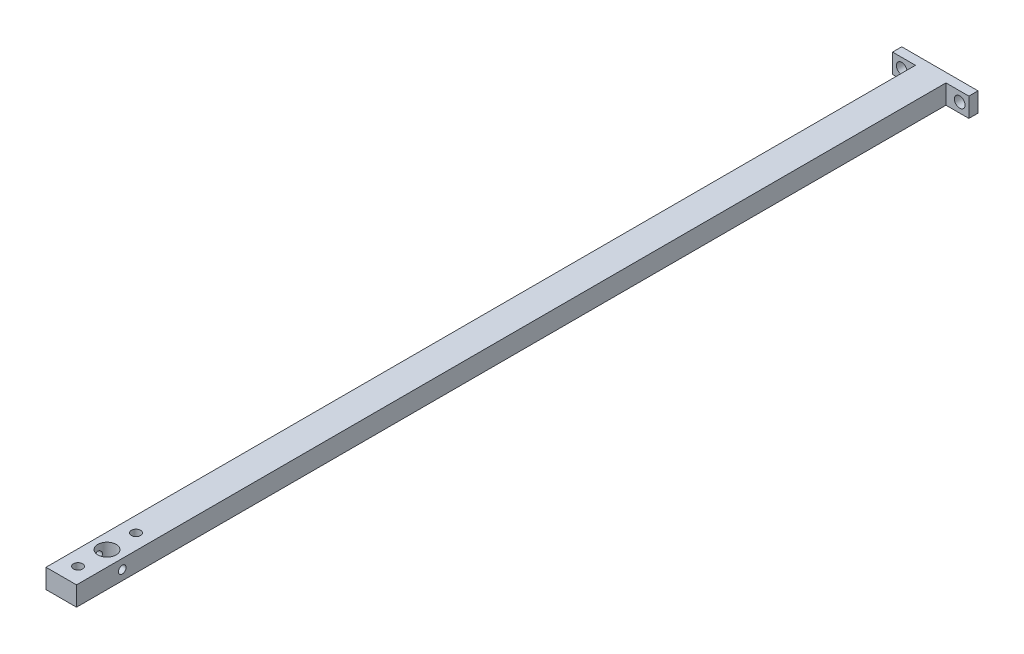
ISO-10303-21;
HEADER;
FILE_DESCRIPTION(('STEP AP214'),'2;1');
FILE_NAME('part.step','',(''),(''),'','','');
FILE_SCHEMA(('AUTOMOTIVE_DESIGN { 1 0 10303 214 1 1 1 1 }'));
ENDSEC;
DATA;
#1=APPLICATION_CONTEXT('core data for automotive mechanical design processes');
#2=APPLICATION_PROTOCOL_DEFINITION('international standard','automotive_design',2000,#1);
#3=PRODUCT_CONTEXT('',#1,'mechanical');
#4=PRODUCT('Part','Part','',(#3));
#5=PRODUCT_RELATED_PRODUCT_CATEGORY('part','',(#4));
#6=PRODUCT_DEFINITION_FORMATION('','',#4);
#7=PRODUCT_DEFINITION_CONTEXT('part definition',#1,'design');
#8=PRODUCT_DEFINITION('design','',#6,#7);
#9=PRODUCT_DEFINITION_SHAPE('','',#8);
#10=(LENGTH_UNIT() NAMED_UNIT(*) SI_UNIT(.MILLI.,.METRE.));
#11=(NAMED_UNIT(*) PLANE_ANGLE_UNIT() SI_UNIT($,.RADIAN.));
#12=(NAMED_UNIT(*) SI_UNIT($,.STERADIAN.) SOLID_ANGLE_UNIT());
#13=UNCERTAINTY_MEASURE_WITH_UNIT(LENGTH_MEASURE(1.E-05),#10,'distance_accuracy_value','');
#14=(GEOMETRIC_REPRESENTATION_CONTEXT(3) GLOBAL_UNCERTAINTY_ASSIGNED_CONTEXT((#13)) GLOBAL_UNIT_ASSIGNED_CONTEXT((#10,
#11,#12)) REPRESENTATION_CONTEXT('',''));
#15=CARTESIAN_POINT('',(0.,0.,0.));
#16=DIRECTION('',(0.,0.,1.));
#17=DIRECTION('',(1.,0.,0.));
#18=AXIS2_PLACEMENT_3D('',#15,#16,#17);
#19=CARTESIAN_POINT('',(-12.5,-3.175,-270.));
#20=DIRECTION('',(0.,0.,1.));
#21=DIRECTION('',(1.,0.,0.));
#22=AXIS2_PLACEMENT_3D('',#19,#20,#21);
#23=PLANE('',#22);
#24=CARTESIAN_POINT('',(-9.50000000000002,0.,-270.));
#25=DIRECTION('',(0.,0.,-1.));
#26=DIRECTION('',(1.,0.,0.));
#27=AXIS2_PLACEMENT_3D('',#24,#25,#26);
#28=CIRCLE('',#27,1.75);
#29=CARTESIAN_POINT('',(-7.75000000000002,0.,-270.));
#30=VERTEX_POINT('',#29);
#31=EDGE_CURVE('E220',#30,#30,#28,.T.);
#32=ORIENTED_EDGE('',*,*,#31,.T.);
#33=EDGE_LOOP('',(#32));
#34=FACE_BOUND('',#33,.T.);
#35=DIRECTION('',(0.,1.,0.));
#36=VECTOR('',#35,1.);
#37=CARTESIAN_POINT('',(-5.00000000000003,-3.175,-270.));
#38=LINE('',#37,#36);
#39=CARTESIAN_POINT('',(-5.00000000000003,-3.175,-270.));
#40=VERTEX_POINT('',#39);
#41=CARTESIAN_POINT('',(-5.00000000000003,3.175,-270.));
#42=VERTEX_POINT('',#41);
#43=EDGE_CURVE('E101',#40,#42,#38,.T.);
#44=ORIENTED_EDGE('',*,*,#43,.T.);
#45=DIRECTION('',(1.,0.,0.));
#46=VECTOR('',#45,1.);
#47=CARTESIAN_POINT('',(-12.5,3.175,-270.));
#48=LINE('',#47,#46);
#49=CARTESIAN_POINT('',(-12.5,3.175,-270.));
#50=VERTEX_POINT('',#49);
#51=EDGE_CURVE('E104',#50,#42,#48,.T.);
#52=ORIENTED_EDGE('',*,*,#51,.F.);
#53=DIRECTION('',(0.,1.,0.));
#54=VECTOR('',#53,1.);
#55=CARTESIAN_POINT('',(-12.5,-3.175,-270.));
#56=LINE('',#55,#54);
#57=CARTESIAN_POINT('',(-12.5,-3.175,-270.));
#58=VERTEX_POINT('',#57);
#59=EDGE_CURVE('E11',#58,#50,#56,.T.);
#60=ORIENTED_EDGE('',*,*,#59,.F.);
#61=DIRECTION('',(1.,0.,0.));
#62=VECTOR('',#61,1.);
#63=CARTESIAN_POINT('',(-12.5,-3.175,-270.));
#64=LINE('',#63,#62);
#65=EDGE_CURVE('E105',#58,#40,#64,.T.);
#66=ORIENTED_EDGE('',*,*,#65,.T.);
#67=EDGE_LOOP('',(#44,#52,#60,#66));
#68=FACE_BOUND('',#67,.T.);
#69=ADVANCED_FACE('F35',(#34,#68),#23,.T.);
#70=CARTESIAN_POINT('',(-12.5,-3.175,-273.));
#71=DIRECTION('',(-1.,0.,0.));
#72=DIRECTION('',(0.,0.,1.));
#73=AXIS2_PLACEMENT_3D('',#70,#71,#72);
#74=PLANE('',#73);
#75=ORIENTED_EDGE('',*,*,#59,.T.);
#76=DIRECTION('',(0.,0.,1.));
#77=VECTOR('',#76,1.);
#78=CARTESIAN_POINT('',(-12.5,3.175,-273.));
#79=LINE('',#78,#77);
#80=CARTESIAN_POINT('',(-12.5,3.175,-273.));
#81=VERTEX_POINT('',#80);
#82=EDGE_CURVE('E124',#81,#50,#79,.T.);
#83=ORIENTED_EDGE('',*,*,#82,.F.);
#84=DIRECTION('',(0.,1.,0.));
#85=VECTOR('',#84,1.);
#86=CARTESIAN_POINT('',(-12.5,-3.175,-273.));
#87=LINE('',#86,#85);
#88=CARTESIAN_POINT('',(-12.5,-3.175,-273.));
#89=VERTEX_POINT('',#88);
#90=EDGE_CURVE('E47',#89,#81,#87,.T.);
#91=ORIENTED_EDGE('',*,*,#90,.F.);
#92=DIRECTION('',(0.,0.,1.));
#93=VECTOR('',#92,1.);
#94=CARTESIAN_POINT('',(-12.5,-3.175,-273.));
#95=LINE('',#94,#93);
#96=EDGE_CURVE('E110',#89,#58,#95,.T.);
#97=ORIENTED_EDGE('',*,*,#96,.T.);
#98=EDGE_LOOP('',(#75,#83,#91,#97));
#99=FACE_BOUND('',#98,.T.);
#100=ADVANCED_FACE('F211',(#99),#74,.T.);
#101=CARTESIAN_POINT('',(12.5,-3.175,-273.));
#102=DIRECTION('',(0.,0.,-1.));
#103=DIRECTION('',(-1.,0.,0.));
#104=AXIS2_PLACEMENT_3D('',#101,#102,#103);
#105=PLANE('',#104);
#106=CARTESIAN_POINT('',(-9.50000000000002,0.,-273.));
#107=DIRECTION('',(0.,0.,-1.));
#108=DIRECTION('',(1.,0.,0.));
#109=AXIS2_PLACEMENT_3D('',#106,#107,#108);
#110=CIRCLE('',#109,1.75);
#111=CARTESIAN_POINT('',(-7.75000000000002,0.,-273.));
#112=VERTEX_POINT('',#111);
#113=EDGE_CURVE('E222',#112,#112,#110,.T.);
#114=ORIENTED_EDGE('',*,*,#113,.F.);
#115=EDGE_LOOP('',(#114));
#116=FACE_BOUND('',#115,.T.);
#117=CARTESIAN_POINT('',(9.49999999999998,0.,-273.));
#118=DIRECTION('',(0.,0.,-1.));
#119=DIRECTION('',(-1.,0.,0.));
#120=AXIS2_PLACEMENT_3D('',#117,#118,#119);
#121=CIRCLE('',#120,1.75);
#122=CARTESIAN_POINT('',(7.74999999999998,0.,-273.));
#123=VERTEX_POINT('',#122);
#124=EDGE_CURVE('E221',#123,#123,#121,.T.);
#125=ORIENTED_EDGE('',*,*,#124,.F.);
#126=EDGE_LOOP('',(#125));
#127=FACE_BOUND('',#126,.T.);
#128=ORIENTED_EDGE('',*,*,#90,.T.);
#129=DIRECTION('',(-1.,0.,0.));
#130=VECTOR('',#129,1.);
#131=CARTESIAN_POINT('',(12.5,3.175,-273.));
#132=LINE('',#131,#130);
#133=CARTESIAN_POINT('',(12.5,3.175,-273.));
#134=VERTEX_POINT('',#133);
#135=EDGE_CURVE('E142',#134,#81,#132,.T.);
#136=ORIENTED_EDGE('',*,*,#135,.F.);
#137=DIRECTION('',(0.,1.,0.));
#138=VECTOR('',#137,1.);
#139=CARTESIAN_POINT('',(12.5,-3.175,-273.));
#140=LINE('',#139,#138);
#141=CARTESIAN_POINT('',(12.5,-3.175,-273.));
#142=VERTEX_POINT('',#141);
#143=EDGE_CURVE('E173',#142,#134,#140,.T.);
#144=ORIENTED_EDGE('',*,*,#143,.F.);
#145=DIRECTION('',(-1.,0.,0.));
#146=VECTOR('',#145,1.);
#147=CARTESIAN_POINT('',(12.5,-3.175,-273.));
#148=LINE('',#147,#146);
#149=EDGE_CURVE('E169',#142,#89,#148,.T.);
#150=ORIENTED_EDGE('',*,*,#149,.T.);
#151=EDGE_LOOP('',(#128,#136,#144,#150));
#152=FACE_BOUND('',#151,.T.);
#153=ADVANCED_FACE('F216',(#116,#127,#152),#105,.T.);
#154=CARTESIAN_POINT('',(12.5,-3.175,-270.));
#155=DIRECTION('',(1.,0.,0.));
#156=DIRECTION('',(0.,0.,-1.));
#157=AXIS2_PLACEMENT_3D('',#154,#155,#156);
#158=PLANE('',#157);
#159=ORIENTED_EDGE('',*,*,#143,.T.);
#160=DIRECTION('',(0.,0.,-1.));
#161=VECTOR('',#160,1.);
#162=CARTESIAN_POINT('',(12.5,3.175,-270.));
#163=LINE('',#162,#161);
#164=CARTESIAN_POINT('',(12.5,3.175,-270.));
#165=VERTEX_POINT('',#164);
#166=EDGE_CURVE('E139',#165,#134,#163,.T.);
#167=ORIENTED_EDGE('',*,*,#166,.F.);
#168=DIRECTION('',(0.,1.,0.));
#169=VECTOR('',#168,1.);
#170=CARTESIAN_POINT('',(12.5,-3.175,-270.));
#171=LINE('',#170,#169);
#172=CARTESIAN_POINT('',(12.5,-3.175,-270.));
#173=VERTEX_POINT('',#172);
#174=EDGE_CURVE('E175',#173,#165,#171,.T.);
#175=ORIENTED_EDGE('',*,*,#174,.F.);
#176=DIRECTION('',(0.,0.,-1.));
#177=VECTOR('',#176,1.);
#178=CARTESIAN_POINT('',(12.5,-3.175,-270.));
#179=LINE('',#178,#177);
#180=EDGE_CURVE('E166',#173,#142,#179,.T.);
#181=ORIENTED_EDGE('',*,*,#180,.T.);
#182=EDGE_LOOP('',(#159,#167,#175,#181));
#183=FACE_BOUND('',#182,.T.);
#184=ADVANCED_FACE('F260',(#183),#158,.T.);
#185=CARTESIAN_POINT('',(5.,-3.175,-270.));
#186=DIRECTION('',(0.,0.,1.));
#187=DIRECTION('',(1.,0.,0.));
#188=AXIS2_PLACEMENT_3D('',#185,#186,#187);
#189=PLANE('',#188);
#190=CARTESIAN_POINT('',(9.49999999999998,0.,-270.));
#191=DIRECTION('',(0.,0.,-1.));
#192=DIRECTION('',(-1.,0.,0.));
#193=AXIS2_PLACEMENT_3D('',#190,#191,#192);
#194=CIRCLE('',#193,1.75);
#195=CARTESIAN_POINT('',(7.74999999999998,0.,-270.));
#196=VERTEX_POINT('',#195);
#197=EDGE_CURVE('E225',#196,#196,#194,.T.);
#198=ORIENTED_EDGE('',*,*,#197,.T.);
#199=EDGE_LOOP('',(#198));
#200=FACE_BOUND('',#199,.T.);
#201=ORIENTED_EDGE('',*,*,#174,.T.);
#202=DIRECTION('',(1.,0.,0.));
#203=VECTOR('',#202,1.);
#204=CARTESIAN_POINT('',(5.,3.175,-270.));
#205=LINE('',#204,#203);
#206=CARTESIAN_POINT('',(5.,3.175,-270.));
#207=VERTEX_POINT('',#206);
#208=EDGE_CURVE('E136',#207,#165,#205,.T.);
#209=ORIENTED_EDGE('',*,*,#208,.F.);
#210=DIRECTION('',(0.,1.,0.));
#211=VECTOR('',#210,1.);
#212=CARTESIAN_POINT('',(5.,-3.175,-270.));
#213=LINE('',#212,#211);
#214=CARTESIAN_POINT('',(5.,-3.175,-270.));
#215=VERTEX_POINT('',#214);
#216=EDGE_CURVE('E177',#215,#207,#213,.T.);
#217=ORIENTED_EDGE('',*,*,#216,.F.);
#218=DIRECTION('',(1.,0.,0.));
#219=VECTOR('',#218,1.);
#220=CARTESIAN_POINT('',(5.,-3.175,-270.));
#221=LINE('',#220,#219);
#222=EDGE_CURVE('E163',#215,#173,#221,.T.);
#223=ORIENTED_EDGE('',*,*,#222,.T.);
#224=EDGE_LOOP('',(#201,#209,#217,#223));
#225=FACE_BOUND('',#224,.T.);
#226=ADVANCED_FACE('F264',(#200,#225),#189,.T.);
#227=CARTESIAN_POINT('',(5.,-3.175,15.));
#228=DIRECTION('',(1.,0.,0.));
#229=DIRECTION('',(0.,0.,-1.));
#230=AXIS2_PLACEMENT_3D('',#227,#228,#229);
#231=PLANE('',#230);
#232=CARTESIAN_POINT('',(5.,0.,0.));
#233=DIRECTION('',(1.,0.,0.));
#234=DIRECTION('',(0.,0.,-1.));
#235=AXIS2_PLACEMENT_3D('',#232,#233,#234);
#236=CIRCLE('',#235,1.24999999999999);
#237=CARTESIAN_POINT('',(5.,0.,-1.24999999999999));
#238=VERTEX_POINT('',#237);
#239=EDGE_CURVE('E185',#238,#238,#236,.T.);
#240=ORIENTED_EDGE('',*,*,#239,.F.);
#241=EDGE_LOOP('',(#240));
#242=FACE_BOUND('',#241,.T.);
#243=ORIENTED_EDGE('',*,*,#216,.T.);
#244=DIRECTION('',(0.,0.,-1.));
#245=VECTOR('',#244,1.);
#246=CARTESIAN_POINT('',(5.,3.175,15.));
#247=LINE('',#246,#245);
#248=CARTESIAN_POINT('',(5.,3.175,15.));
#249=VERTEX_POINT('',#248);
#250=EDGE_CURVE('E133',#249,#207,#247,.T.);
#251=ORIENTED_EDGE('',*,*,#250,.F.);
#252=DIRECTION('',(0.,1.,0.));
#253=VECTOR('',#252,1.);
#254=CARTESIAN_POINT('',(5.,-3.175,15.));
#255=LINE('',#254,#253);
#256=CARTESIAN_POINT('',(5.,-3.175,15.));
#257=VERTEX_POINT('',#256);
#258=EDGE_CURVE('E179',#257,#249,#255,.T.);
#259=ORIENTED_EDGE('',*,*,#258,.F.);
#260=DIRECTION('',(0.,0.,-1.));
#261=VECTOR('',#260,1.);
#262=CARTESIAN_POINT('',(5.,-3.175,15.));
#263=LINE('',#262,#261);
#264=EDGE_CURVE('E160',#257,#215,#263,.T.);
#265=ORIENTED_EDGE('',*,*,#264,.T.);
#266=EDGE_LOOP('',(#243,#251,#259,#265));
#267=FACE_BOUND('',#266,.T.);
#268=ADVANCED_FACE('F268',(#242,#267),#231,.T.);
#269=CARTESIAN_POINT('',(-5.,-3.175,15.));
#270=DIRECTION('',(0.,0.,1.));
#271=DIRECTION('',(1.,0.,0.));
#272=AXIS2_PLACEMENT_3D('',#269,#270,#271);
#273=PLANE('',#272);
#274=ORIENTED_EDGE('',*,*,#258,.T.);
#275=DIRECTION('',(1.,0.,0.));
#276=VECTOR('',#275,1.);
#277=CARTESIAN_POINT('',(-5.,3.175,15.));
#278=LINE('',#277,#276);
#279=CARTESIAN_POINT('',(-5.,3.175,15.));
#280=VERTEX_POINT('',#279);
#281=EDGE_CURVE('E118',#280,#249,#278,.T.);
#282=ORIENTED_EDGE('',*,*,#281,.F.);
#283=DIRECTION('',(0.,1.,0.));
#284=VECTOR('',#283,1.);
#285=CARTESIAN_POINT('',(-5.,-3.175,15.));
#286=LINE('',#285,#284);
#287=CARTESIAN_POINT('',(-5.,-3.175,15.));
#288=VERTEX_POINT('',#287);
#289=EDGE_CURVE('E109',#288,#280,#286,.T.);
#290=ORIENTED_EDGE('',*,*,#289,.F.);
#291=DIRECTION('',(1.,0.,0.));
#292=VECTOR('',#291,1.);
#293=CARTESIAN_POINT('',(-5.,-3.175,15.));
#294=LINE('',#293,#292);
#295=EDGE_CURVE('E157',#288,#257,#294,.T.);
#296=ORIENTED_EDGE('',*,*,#295,.T.);
#297=EDGE_LOOP('',(#274,#282,#290,#296));
#298=FACE_BOUND('',#297,.T.);
#299=ADVANCED_FACE('F272',(#298),#273,.T.);
#300=CARTESIAN_POINT('',(-5.00000000000003,-3.175,-270.));
#301=DIRECTION('',(-1.,0.,0.));
#302=DIRECTION('',(0.,0.,1.));
#303=AXIS2_PLACEMENT_3D('',#300,#301,#302);
#304=PLANE('',#303);
#305=CARTESIAN_POINT('',(-5.,0.,0.));
#306=DIRECTION('',(-1.,0.,0.));
#307=DIRECTION('',(0.,0.,1.));
#308=AXIS2_PLACEMENT_3D('',#305,#306,#307);
#309=CIRCLE('',#308,1.24999999999999);
#310=CARTESIAN_POINT('',(-5.,0.,1.24999999999999));
#311=VERTEX_POINT('',#310);
#312=EDGE_CURVE('E228',#311,#311,#309,.T.);
#313=ORIENTED_EDGE('',*,*,#312,.F.);
#314=EDGE_LOOP('',(#313));
#315=FACE_BOUND('',#314,.T.);
#316=ORIENTED_EDGE('',*,*,#289,.T.);
#317=DIRECTION('',(0.,0.,1.));
#318=VECTOR('',#317,1.);
#319=CARTESIAN_POINT('',(-5.00000000000003,3.175,-270.));
#320=LINE('',#319,#318);
#321=EDGE_CURVE('E113',#42,#280,#320,.T.);
#322=ORIENTED_EDGE('',*,*,#321,.F.);
#323=ORIENTED_EDGE('',*,*,#43,.F.);
#324=DIRECTION('',(0.,0.,1.));
#325=VECTOR('',#324,1.);
#326=CARTESIAN_POINT('',(-5.00000000000003,-3.175,-270.));
#327=LINE('',#326,#325);
#328=EDGE_CURVE('E155',#40,#288,#327,.T.);
#329=ORIENTED_EDGE('',*,*,#328,.T.);
#330=EDGE_LOOP('',(#316,#322,#323,#329));
#331=FACE_BOUND('',#330,.T.);
#332=ADVANCED_FACE('F114',(#315,#331),#304,.T.);
#333=CARTESIAN_POINT('',(0.,-3.175,0.));
#334=DIRECTION('',(0.,-1.,0.));
#335=DIRECTION('',(0.,0.,-1.));
#336=AXIS2_PLACEMENT_3D('',#333,#334,#335);
#337=PLANE('',#336);
#338=CARTESIAN_POINT('',(0.,-3.175,0.));
#339=DIRECTION('',(0.,1.,0.));
#340=DIRECTION('',(0.,0.,1.));
#341=AXIS2_PLACEMENT_3D('',#338,#339,#340);
#342=CIRCLE('',#341,3.);
#343=CARTESIAN_POINT('',(0.,-3.175,3.));
#344=VERTEX_POINT('',#343);
#345=EDGE_CURVE('E145',#344,#344,#342,.T.);
#346=ORIENTED_EDGE('',*,*,#345,.T.);
#347=EDGE_LOOP('',(#346));
#348=FACE_BOUND('',#347,.T.);
#349=CARTESIAN_POINT('',(0.,-3.175,-9.5));
#350=DIRECTION('',(0.,1.,0.));
#351=DIRECTION('',(0.,0.,1.));
#352=AXIS2_PLACEMENT_3D('',#349,#350,#351);
#353=CIRCLE('',#352,1.5);
#354=CARTESIAN_POINT('',(0.,-3.175,-8.));
#355=VERTEX_POINT('',#354);
#356=EDGE_CURVE('E148',#355,#355,#353,.T.);
#357=ORIENTED_EDGE('',*,*,#356,.T.);
#358=EDGE_LOOP('',(#357));
#359=FACE_BOUND('',#358,.T.);
#360=CARTESIAN_POINT('',(0.,-3.175,9.5));
#361=DIRECTION('',(0.,1.,0.));
#362=DIRECTION('',(0.,0.,1.));
#363=AXIS2_PLACEMENT_3D('',#360,#361,#362);
#364=CIRCLE('',#363,1.5);
#365=CARTESIAN_POINT('',(0.,-3.175,11.));
#366=VERTEX_POINT('',#365);
#367=EDGE_CURVE('E151',#366,#366,#364,.T.);
#368=ORIENTED_EDGE('',*,*,#367,.T.);
#369=EDGE_LOOP('',(#368));
#370=FACE_BOUND('',#369,.T.);
#371=ORIENTED_EDGE('',*,*,#65,.F.);
#372=ORIENTED_EDGE('',*,*,#96,.F.);
#373=ORIENTED_EDGE('',*,*,#149,.F.);
#374=ORIENTED_EDGE('',*,*,#180,.F.);
#375=ORIENTED_EDGE('',*,*,#222,.F.);
#376=ORIENTED_EDGE('',*,*,#264,.F.);
#377=ORIENTED_EDGE('',*,*,#295,.F.);
#378=ORIENTED_EDGE('',*,*,#328,.F.);
#379=EDGE_LOOP('',(#371,#372,#373,#374,#375,#376,#377,#378));
#380=FACE_BOUND('',#379,.T.);
#381=ADVANCED_FACE('F250',(#348,#359,#370,#380),#337,.T.);
#382=CARTESIAN_POINT('',(0.,-3.175,9.5));
#383=DIRECTION('',(0.,1.,0.));
#384=DIRECTION('',(0.,0.,1.));
#385=AXIS2_PLACEMENT_3D('',#382,#383,#384);
#386=CYLINDRICAL_SURFACE('',#385,1.5);
#387=ORIENTED_EDGE('',*,*,#367,.F.);
#388=EDGE_LOOP('',(#387));
#389=FACE_BOUND('',#388,.T.);
#390=CARTESIAN_POINT('',(0.,3.175,9.5));
#391=DIRECTION('',(0.,1.,0.));
#392=DIRECTION('',(0.,0.,1.));
#393=AXIS2_PLACEMENT_3D('',#390,#391,#392);
#394=CIRCLE('',#393,1.5);
#395=CARTESIAN_POINT('',(0.,3.175,11.));
#396=VERTEX_POINT('',#395);
#397=EDGE_CURVE('E125',#396,#396,#394,.T.);
#398=ORIENTED_EDGE('',*,*,#397,.T.);
#399=EDGE_LOOP('',(#398));
#400=FACE_BOUND('',#399,.T.);
#401=ADVANCED_FACE('F245',(#389,#400),#386,.F.);
#402=CARTESIAN_POINT('',(0.,-3.175,-9.5));
#403=DIRECTION('',(0.,1.,0.));
#404=DIRECTION('',(0.,0.,1.));
#405=AXIS2_PLACEMENT_3D('',#402,#403,#404);
#406=CYLINDRICAL_SURFACE('',#405,1.5);
#407=ORIENTED_EDGE('',*,*,#356,.F.);
#408=EDGE_LOOP('',(#407));
#409=FACE_BOUND('',#408,.T.);
#410=CARTESIAN_POINT('',(0.,3.175,-9.5));
#411=DIRECTION('',(0.,1.,0.));
#412=DIRECTION('',(0.,0.,1.));
#413=AXIS2_PLACEMENT_3D('',#410,#411,#412);
#414=CIRCLE('',#413,1.5);
#415=CARTESIAN_POINT('',(0.,3.175,-8.));
#416=VERTEX_POINT('',#415);
#417=EDGE_CURVE('E128',#416,#416,#414,.T.);
#418=ORIENTED_EDGE('',*,*,#417,.T.);
#419=EDGE_LOOP('',(#418));
#420=FACE_BOUND('',#419,.T.);
#421=ADVANCED_FACE('F208',(#409,#420),#406,.F.);
#422=CARTESIAN_POINT('',(0.,-3.175,0.));
#423=DIRECTION('',(0.,1.,0.));
#424=DIRECTION('',(0.,0.,1.));
#425=AXIS2_PLACEMENT_3D('',#422,#423,#424);
#426=CYLINDRICAL_SURFACE('',#425,3.);
#427=CARTESIAN_POINT('',(-2.72717802865893,0.,-1.24999999999999));
#428=CARTESIAN_POINT('',(-2.7271851956322,-0.0666718908968531,-1.24999259066567));
#429=CARTESIAN_POINT('',(-2.72965859534401,-0.133452656826215,-1.24463203881502));
#430=CARTESIAN_POINT('',(-2.73923833650884,-0.265086942057141,-1.22339678947784));
#431=CARTESIAN_POINT('',(-2.74635725824267,-0.329934726675234,-1.20749354003276));
#432=CARTESIAN_POINT('',(-2.76426917574768,-0.455561129691072,-1.1658998841945));
#433=CARTESIAN_POINT('',(-2.77504717562616,-0.516355163715014,-1.14024937431427));
#434=CARTESIAN_POINT('',(-2.79904148565793,-0.632759449578049,-1.08000637754462));
#435=CARTESIAN_POINT('',(-2.81225721880784,-0.688370923433117,-1.04541600591531));
#436=CARTESIAN_POINT('',(-2.84055762619857,-0.796325724973466,-0.96597388267616));
#437=CARTESIAN_POINT('',(-2.85570568079146,-0.848307558744088,-0.920653238184403));
#438=CARTESIAN_POINT('',(-2.88564295372227,-0.944200222497551,-0.822021675745544));
#439=CARTESIAN_POINT('',(-2.90043203180789,-0.988107940613006,-0.768707691373999));
#440=CARTESIAN_POINT('',(-2.92875537930614,-1.06844953087927,-0.652763393797344));
#441=CARTESIAN_POINT('',(-2.94220739975291,-1.10447662803234,-0.589829293683655));
#442=CARTESIAN_POINT('',(-2.96556519993426,-1.1652760205056,-0.458132022362349));
#443=CARTESIAN_POINT('',(-2.97547255347157,-1.19005331196421,-0.389371454872121));
#444=CARTESIAN_POINT('',(-2.99017521042367,-1.22633945875673,-0.251768498025163));
#445=CARTESIAN_POINT('',(-2.99520971127466,-1.23847169490204,-0.183116576196079));
#446=CARTESIAN_POINT('',(-3.00046828611204,-1.25113764115985,-0.0445791803650053));
#447=CARTESIAN_POINT('',(-3.00069431131015,-1.25167605588295,0.0253057817645167));
#448=CARTESIAN_POINT('',(-2.99645129133057,-1.24146571906667,0.159792780112568));
#449=CARTESIAN_POINT('',(-2.99226714648664,-1.23140189947427,0.224457488607313));
#450=CARTESIAN_POINT('',(-2.98006516750309,-1.20144689736183,0.351082893931455));
#451=CARTESIAN_POINT('',(-2.97204705074577,-1.18155499036983,0.413043391054914));
#452=CARTESIAN_POINT('',(-2.95279852414029,-1.13227195910535,0.533638118077523));
#453=CARTESIAN_POINT('',(-2.94152097126085,-1.10274053712917,0.592207177074903));
#454=CARTESIAN_POINT('',(-2.91685713989805,-1.03515424329965,0.70371176728196));
#455=CARTESIAN_POINT('',(-2.90347011666255,-0.997096359155008,0.756645297756971));
#456=CARTESIAN_POINT('',(-2.87481698777061,-0.910417579595378,0.85934091170792));
#457=CARTESIAN_POINT('',(-2.8594849435601,-0.861241208720988,0.908616437316236));
#458=CARTESIAN_POINT('',(-2.82937860681471,-0.755288559293414,0.998431414927663));
#459=CARTESIAN_POINT('',(-2.8146045313137,-0.698509361707903,1.03896749582431));
#460=CARTESIAN_POINT('',(-2.78681612355339,-0.576604963338085,1.11140189250063));
#461=CARTESIAN_POINT('',(-2.77387558556715,-0.511266794256715,1.1429725335554));
#462=CARTESIAN_POINT('',(-2.75209844221011,-0.375518955025498,1.19446432058391));
#463=CARTESIAN_POINT('',(-2.74325890334594,-0.305112951730452,1.21439379627312));
#464=CARTESIAN_POINT('',(-2.73141212519724,-0.166103191085998,1.2408002516812));
#465=CARTESIAN_POINT('',(-2.72806369197117,-0.097678877740948,1.24806614632865));
#466=CARTESIAN_POINT('',(-2.72660286810642,0.0394784824115013,1.25125630518998));
#467=CARTESIAN_POINT('',(-2.72848866599319,0.108211414191712,1.24718449318148));
#468=CARTESIAN_POINT('',(-2.7369313134575,0.239398385430447,1.22853477565555));
#469=CARTESIAN_POINT('',(-2.74318138016618,0.301972686786801,1.21464618818048));
#470=CARTESIAN_POINT('',(-2.75925630297447,0.42385129649787,1.17767058564225));
#471=CARTESIAN_POINT('',(-2.76908199460161,0.483154836830708,1.15458142053124));
#472=CARTESIAN_POINT('',(-2.79170797857,0.599615310356467,1.09877520805186));
#473=CARTESIAN_POINT('',(-2.80461662202282,0.656574974610321,1.06569183306197));
#474=CARTESIAN_POINT('',(-2.83180003740794,0.764408052499018,0.991200784385964));
#475=CARTESIAN_POINT('',(-2.84607539920583,0.815278816701864,0.949789507875981));
#476=CARTESIAN_POINT('',(-2.87578619784533,0.913800134884001,0.855844455715499));
#477=CARTESIAN_POINT('',(-2.89122146708842,0.960851399950654,0.802679661479733));
#478=CARTESIAN_POINT('',(-2.92043361183923,1.04547229197932,0.688851512553534));
#479=CARTESIAN_POINT('',(-2.93421036577014,1.0830412240637,0.628187608803651));
#480=CARTESIAN_POINT('',(-2.9586425158565,1.14758987544357,0.50065468080338));
#481=CARTESIAN_POINT('',(-2.96928983138826,1.17454224128947,0.433770169638503));
#482=CARTESIAN_POINT('',(-2.98618173103366,1.21661679233442,0.295858835154414));
#483=CARTESIAN_POINT('',(-2.9924289351992,1.23174601822606,0.224834504225192));
#484=CARTESIAN_POINT('',(-2.9995153479751,1.2488581255203,0.0860165335064093));
#485=CARTESIAN_POINT('',(-3.00070204534225,1.25168599969696,0.0183440847938964));
#486=CARTESIAN_POINT('',(-2.99849523480953,1.24638685870605,-0.116486811714286));
#487=CARTESIAN_POINT('',(-2.99510252984313,1.23826176398713,-0.183645347541155));
#488=CARTESIAN_POINT('',(-2.98430065981734,1.21189392784133,-0.313086482449184));
#489=CARTESIAN_POINT('',(-2.97703824209233,1.19402031953044,-0.375457537843568));
#490=CARTESIAN_POINT('',(-2.95929499847058,1.14906575279086,-0.49629223050133));
#491=CARTESIAN_POINT('',(-2.94881356124207,1.12198304533509,-0.554755122985825));
#492=CARTESIAN_POINT('',(-2.92505825398663,1.05801047078553,-0.669024565478779));
#493=CARTESIAN_POINT('',(-2.91167959188766,1.020732698576,-0.724591657976679));
#494=CARTESIAN_POINT('',(-2.88371561874231,0.937992817128101,-0.828918675638778));
#495=CARTESIAN_POINT('',(-2.86912986083797,0.892527669593244,-0.877676061786039));
#496=CARTESIAN_POINT('',(-2.83914845259141,0.79105517414559,-0.970449787231576));
#497=CARTESIAN_POINT('',(-2.82376522857896,0.734540985378874,-1.01391775364846));
#498=CARTESIAN_POINT('',(-2.79495552690186,0.614541259319801,-1.09083332306674));
#499=CARTESIAN_POINT('',(-2.78153014522558,0.551051851941852,-1.12427532456754));
#500=CARTESIAN_POINT('',(-2.75842557732643,0.419056164977245,-1.17982766043576));
#501=CARTESIAN_POINT('',(-2.74872654469865,0.350578841206788,-1.20199823632853));
#502=CARTESIAN_POINT('',(-2.73440803066668,0.210460426149329,-1.234235564538));
#503=CARTESIAN_POINT('',(-2.72977151604981,0.138830792725698,-1.24434291521209));
#504=CARTESIAN_POINT('',(-2.72744979732688,0.0446414757381113,-1.24940464923649));
#505=CARTESIAN_POINT('',(-2.72717562860875,0.0223268426119639,-1.25000248121118));
#506=CARTESIAN_POINT('',(-2.72717802865893,0.,-1.24999999999999));
#507=B_SPLINE_CURVE_WITH_KNOTS('',3,(#427,#428,#429,#430,#431,#432,#433,#434,#435,#436,#437,
#438,#439,#440,#441,#442,#443,#444,#445,#446,#447,#448,#449,#450,#451,#452,#453,#454,#455,#456,
#457,#458,#459,#460,#461,#462,#463,#464,#465,#466,#467,#468,#469,#470,#471,#472,#473,#474,#475,
#476,#477,#478,#479,#480,#481,#482,#483,#484,#485,#486,#487,#488,#489,#490,#491,#492,#493,#494,
#495,#496,#497,#498,#499,#500,#501,#502,#503,#504,#505,#506),.UNSPECIFIED.,.T.,.F.,(4,2,2,2,2,2,
2,2,2,2,2,2,2,2,2,2,2,2,2,2,2,2,2,2,2,2,2,2,2,2,2,2,2,2,2,2,2,2,2,4),(0.,0.199951711985513,
0.400447161842173,0.600130652152109,0.799766938550096,1.01066841430653,1.2216510045991,
1.44178476577923,1.6618206677489,1.87040605977951,2.07890680917929,2.27471840245092,
2.47054443201882,2.66935814640064,2.86824221022482,3.08114531844483,3.29413040441365,
3.5141154566672,3.73394290745567,3.93950778306305,4.14500152518446,4.33733901066189,
4.52972146913527,4.73025126818166,4.93086800795463,5.14781662735511,5.36478114041863,
5.58230105955592,5.79969134643004,6.0018863509405,6.20404590801911,6.39903415036484,
6.59405944632169,6.79789862829033,7.00181361048901,7.21960426908073,7.43751638139185,
7.65425125796861,7.87025464546158,7.93721375436701),.UNSPECIFIED.);
#508=CARTESIAN_POINT('',(-2.72717802865893,0.,-1.24999999999999));
#509=VERTEX_POINT('',#508);
#510=EDGE_CURVE('E38',#509,#509,#507,.T.);
#511=ORIENTED_EDGE('',*,*,#510,.T.);
#512=EDGE_LOOP('',(#511));
#513=FACE_BOUND('',#512,.T.);
#514=CARTESIAN_POINT('',(2.72717802865893,0.,-1.24999999999999));
#515=CARTESIAN_POINT('',(2.7271851956322,0.0666718908968531,-1.24999259066567));
#516=CARTESIAN_POINT('',(2.72965859534401,0.133452656826215,-1.24463203881502));
#517=CARTESIAN_POINT('',(2.73923833650884,0.265086942057141,-1.22339678947784));
#518=CARTESIAN_POINT('',(2.74635725824267,0.329934726675234,-1.20749354003276));
#519=CARTESIAN_POINT('',(2.76426917574768,0.455561129691072,-1.1658998841945));
#520=CARTESIAN_POINT('',(2.77504717562616,0.516355163715014,-1.14024937431427));
#521=CARTESIAN_POINT('',(2.79904148565793,0.632759449578049,-1.08000637754462));
#522=CARTESIAN_POINT('',(2.81225721880784,0.688370923433117,-1.04541600591531));
#523=CARTESIAN_POINT('',(2.84055762619857,0.796325724973466,-0.96597388267616));
#524=CARTESIAN_POINT('',(2.85570568079146,0.848307558744088,-0.920653238184403));
#525=CARTESIAN_POINT('',(2.88564295372227,0.944200222497551,-0.822021675745544));
#526=CARTESIAN_POINT('',(2.90043203180789,0.988107940613006,-0.768707691373999));
#527=CARTESIAN_POINT('',(2.92875537930614,1.06844953087927,-0.652763393797344));
#528=CARTESIAN_POINT('',(2.94220739975291,1.10447662803234,-0.589829293683655));
#529=CARTESIAN_POINT('',(2.96556519993426,1.1652760205056,-0.458132022362349));
#530=CARTESIAN_POINT('',(2.97547255347157,1.19005331196421,-0.389371454872121));
#531=CARTESIAN_POINT('',(2.99017521042367,1.22633945875673,-0.251768498025163));
#532=CARTESIAN_POINT('',(2.99520971127466,1.23847169490204,-0.183116576196079));
#533=CARTESIAN_POINT('',(3.00046828611204,1.25113764115985,-0.0445791803650053));
#534=CARTESIAN_POINT('',(3.00069431131015,1.25167605588295,0.0253057817645167));
#535=CARTESIAN_POINT('',(2.99645129133057,1.24146571906667,0.159792780112568));
#536=CARTESIAN_POINT('',(2.99226714648664,1.23140189947427,0.224457488607313));
#537=CARTESIAN_POINT('',(2.98006516750309,1.20144689736183,0.351082893931455));
#538=CARTESIAN_POINT('',(2.97204705074577,1.18155499036983,0.413043391054914));
#539=CARTESIAN_POINT('',(2.95279852414029,1.13227195910535,0.533638118077523));
#540=CARTESIAN_POINT('',(2.94152097126085,1.10274053712917,0.592207177074903));
#541=CARTESIAN_POINT('',(2.91685713989805,1.03515424329965,0.70371176728196));
#542=CARTESIAN_POINT('',(2.90347011666255,0.997096359155008,0.756645297756971));
#543=CARTESIAN_POINT('',(2.87481698777061,0.910417579595378,0.85934091170792));
#544=CARTESIAN_POINT('',(2.8594849435601,0.861241208720988,0.908616437316236));
#545=CARTESIAN_POINT('',(2.82937860681471,0.755288559293414,0.998431414927663));
#546=CARTESIAN_POINT('',(2.8146045313137,0.698509361707903,1.03896749582431));
#547=CARTESIAN_POINT('',(2.78681612355339,0.576604963338085,1.11140189250063));
#548=CARTESIAN_POINT('',(2.77387558556715,0.511266794256715,1.1429725335554));
#549=CARTESIAN_POINT('',(2.75209844221011,0.375518955025498,1.19446432058391));
#550=CARTESIAN_POINT('',(2.74325890334594,0.305112951730452,1.21439379627312));
#551=CARTESIAN_POINT('',(2.73141212519724,0.166103191085998,1.2408002516812));
#552=CARTESIAN_POINT('',(2.72806369197117,0.097678877740948,1.24806614632865));
#553=CARTESIAN_POINT('',(2.72660286810642,-0.0394784824115013,1.25125630518998));
#554=CARTESIAN_POINT('',(2.72848866599319,-0.108211414191712,1.24718449318148));
#555=CARTESIAN_POINT('',(2.7369313134575,-0.239398385430447,1.22853477565555));
#556=CARTESIAN_POINT('',(2.74318138016618,-0.301972686786801,1.21464618818048));
#557=CARTESIAN_POINT('',(2.75925630297447,-0.42385129649787,1.17767058564225));
#558=CARTESIAN_POINT('',(2.76908199460161,-0.483154836830708,1.15458142053124));
#559=CARTESIAN_POINT('',(2.79170797857,-0.599615310356467,1.09877520805186));
#560=CARTESIAN_POINT('',(2.80461662202282,-0.656574974610321,1.06569183306197));
#561=CARTESIAN_POINT('',(2.83180003740794,-0.764408052499018,0.991200784385964));
#562=CARTESIAN_POINT('',(2.84607539920583,-0.815278816701864,0.949789507875981));
#563=CARTESIAN_POINT('',(2.87578619784533,-0.913800134884001,0.855844455715499));
#564=CARTESIAN_POINT('',(2.89122146708842,-0.960851399950654,0.802679661479733));
#565=CARTESIAN_POINT('',(2.92043361183923,-1.04547229197932,0.688851512553534));
#566=CARTESIAN_POINT('',(2.93421036577014,-1.0830412240637,0.628187608803651));
#567=CARTESIAN_POINT('',(2.9586425158565,-1.14758987544357,0.50065468080338));
#568=CARTESIAN_POINT('',(2.96928983138826,-1.17454224128947,0.433770169638503));
#569=CARTESIAN_POINT('',(2.98618173103366,-1.21661679233442,0.295858835154414));
#570=CARTESIAN_POINT('',(2.9924289351992,-1.23174601822606,0.224834504225192));
#571=CARTESIAN_POINT('',(2.9995153479751,-1.2488581255203,0.0860165335064093));
#572=CARTESIAN_POINT('',(3.00070204534225,-1.25168599969696,0.0183440847938964));
#573=CARTESIAN_POINT('',(2.99849523480953,-1.24638685870605,-0.116486811714286));
#574=CARTESIAN_POINT('',(2.99510252984313,-1.23826176398713,-0.183645347541155));
#575=CARTESIAN_POINT('',(2.98430065981734,-1.21189392784133,-0.313086482449184));
#576=CARTESIAN_POINT('',(2.97703824209233,-1.19402031953044,-0.375457537843568));
#577=CARTESIAN_POINT('',(2.95929499847058,-1.14906575279086,-0.49629223050133));
#578=CARTESIAN_POINT('',(2.94881356124207,-1.12198304533509,-0.554755122985825));
#579=CARTESIAN_POINT('',(2.92505825398663,-1.05801047078553,-0.669024565478779));
#580=CARTESIAN_POINT('',(2.91167959188766,-1.020732698576,-0.724591657976679));
#581=CARTESIAN_POINT('',(2.88371561874231,-0.937992817128101,-0.828918675638778));
#582=CARTESIAN_POINT('',(2.86912986083797,-0.892527669593244,-0.877676061786039));
#583=CARTESIAN_POINT('',(2.83914845259141,-0.79105517414559,-0.970449787231576));
#584=CARTESIAN_POINT('',(2.82376522857896,-0.734540985378874,-1.01391775364846));
#585=CARTESIAN_POINT('',(2.79495552690186,-0.614541259319801,-1.09083332306674));
#586=CARTESIAN_POINT('',(2.78153014522558,-0.551051851941852,-1.12427532456754));
#587=CARTESIAN_POINT('',(2.75842557732643,-0.419056164977245,-1.17982766043576));
#588=CARTESIAN_POINT('',(2.74872654469865,-0.350578841206788,-1.20199823632853));
#589=CARTESIAN_POINT('',(2.73440803066668,-0.210460426149329,-1.234235564538));
#590=CARTESIAN_POINT('',(2.72977151604981,-0.138830792725698,-1.24434291521209));
#591=CARTESIAN_POINT('',(2.72744979732688,-0.0446414757381113,-1.24940464923649));
#592=CARTESIAN_POINT('',(2.72717562860875,-0.0223268426119639,-1.25000248121118));
#593=CARTESIAN_POINT('',(2.72717802865893,0.,-1.24999999999999));
#594=B_SPLINE_CURVE_WITH_KNOTS('',3,(#514,#515,#516,#517,#518,#519,#520,#521,#522,#523,#524,
#525,#526,#527,#528,#529,#530,#531,#532,#533,#534,#535,#536,#537,#538,#539,#540,#541,#542,#543,
#544,#545,#546,#547,#548,#549,#550,#551,#552,#553,#554,#555,#556,#557,#558,#559,#560,#561,#562,
#563,#564,#565,#566,#567,#568,#569,#570,#571,#572,#573,#574,#575,#576,#577,#578,#579,#580,#581,
#582,#583,#584,#585,#586,#587,#588,#589,#590,#591,#592,#593),.UNSPECIFIED.,.T.,.F.,(4,2,2,2,2,2,
2,2,2,2,2,2,2,2,2,2,2,2,2,2,2,2,2,2,2,2,2,2,2,2,2,2,2,2,2,2,2,2,2,4),(0.,0.199951711985513,
0.400447161842173,0.600130652152109,0.799766938550096,1.01066841430653,1.2216510045991,
1.44178476577923,1.6618206677489,1.87040605977951,2.07890680917929,2.27471840245092,
2.47054443201882,2.66935814640064,2.86824221022482,3.08114531844483,3.29413040441365,
3.5141154566672,3.73394290745567,3.93950778306305,4.14500152518446,4.33733901066189,
4.52972146913527,4.73025126818166,4.93086800795463,5.14781662735511,5.36478114041863,
5.58230105955592,5.79969134643004,6.0018863509405,6.20404590801911,6.39903415036484,
6.59405944632169,6.79789862829033,7.00181361048901,7.21960426908073,7.43751638139185,
7.65425125796861,7.87025464546158,7.93721375436701),.UNSPECIFIED.);
#595=CARTESIAN_POINT('',(2.72717802865893,0.,-1.24999999999999));
#596=VERTEX_POINT('',#595);
#597=EDGE_CURVE('E181',#596,#596,#594,.T.);
#598=ORIENTED_EDGE('',*,*,#597,.T.);
#599=EDGE_LOOP('',(#598));
#600=FACE_BOUND('',#599,.T.);
#601=ORIENTED_EDGE('',*,*,#345,.F.);
#602=EDGE_LOOP('',(#601));
#603=FACE_BOUND('',#602,.T.);
#604=CARTESIAN_POINT('',(0.,3.175,0.));
#605=DIRECTION('',(0.,1.,0.));
#606=DIRECTION('',(0.,0.,1.));
#607=AXIS2_PLACEMENT_3D('',#604,#605,#606);
#608=CIRCLE('',#607,3.);
#609=CARTESIAN_POINT('',(0.,3.175,3.));
#610=VERTEX_POINT('',#609);
#611=EDGE_CURVE('E234',#610,#610,#608,.T.);
#612=ORIENTED_EDGE('',*,*,#611,.T.);
#613=EDGE_LOOP('',(#612));
#614=FACE_BOUND('',#613,.T.);
#615=ADVANCED_FACE('F186',(#513,#600,#603,#614),#426,.F.);
#616=CARTESIAN_POINT('',(0.,3.175,0.));
#617=DIRECTION('',(0.,-1.,0.));
#618=DIRECTION('',(0.,0.,-1.));
#619=AXIS2_PLACEMENT_3D('',#616,#617,#618);
#620=PLANE('',#619);
#621=ORIENTED_EDGE('',*,*,#51,.T.);
#622=ORIENTED_EDGE('',*,*,#321,.T.);
#623=ORIENTED_EDGE('',*,*,#281,.T.);
#624=ORIENTED_EDGE('',*,*,#250,.T.);
#625=ORIENTED_EDGE('',*,*,#208,.T.);
#626=ORIENTED_EDGE('',*,*,#166,.T.);
#627=ORIENTED_EDGE('',*,*,#135,.T.);
#628=ORIENTED_EDGE('',*,*,#82,.T.);
#629=EDGE_LOOP('',(#621,#622,#623,#624,#625,#626,#627,#628));
#630=FACE_BOUND('',#629,.T.);
#631=ORIENTED_EDGE('',*,*,#397,.F.);
#632=EDGE_LOOP('',(#631));
#633=FACE_BOUND('',#632,.T.);
#634=ORIENTED_EDGE('',*,*,#417,.F.);
#635=EDGE_LOOP('',(#634));
#636=FACE_BOUND('',#635,.T.);
#637=ORIENTED_EDGE('',*,*,#611,.F.);
#638=EDGE_LOOP('',(#637));
#639=FACE_BOUND('',#638,.T.);
#640=ADVANCED_FACE('F121',(#630,#633,#636,#639),#620,.F.);
#641=CARTESIAN_POINT('',(9.49999999999998,0.,-270.));
#642=DIRECTION('',(0.,0.,-1.));
#643=DIRECTION('',(-1.,0.,0.));
#644=AXIS2_PLACEMENT_3D('',#641,#642,#643);
#645=CYLINDRICAL_SURFACE('',#644,1.75);
#646=ORIENTED_EDGE('',*,*,#197,.F.);
#647=EDGE_LOOP('',(#646));
#648=FACE_BOUND('',#647,.T.);
#649=ORIENTED_EDGE('',*,*,#124,.T.);
#650=EDGE_LOOP('',(#649));
#651=FACE_BOUND('',#650,.T.);
#652=ADVANCED_FACE('F200',(#648,#651),#645,.F.);
#653=CARTESIAN_POINT('',(-9.50000000000002,0.,-270.));
#654=DIRECTION('',(0.,0.,-1.));
#655=DIRECTION('',(-1.,0.,0.));
#656=AXIS2_PLACEMENT_3D('',#653,#654,#655);
#657=CYLINDRICAL_SURFACE('',#656,1.75);
#658=ORIENTED_EDGE('',*,*,#31,.F.);
#659=EDGE_LOOP('',(#658));
#660=FACE_BOUND('',#659,.T.);
#661=ORIENTED_EDGE('',*,*,#113,.T.);
#662=EDGE_LOOP('',(#661));
#663=FACE_BOUND('',#662,.T.);
#664=ADVANCED_FACE('F196',(#660,#663),#657,.F.);
#665=CARTESIAN_POINT('',(5.,0.,0.));
#666=DIRECTION('',(1.,0.,0.));
#667=DIRECTION('',(0.,0.,-1.));
#668=AXIS2_PLACEMENT_3D('',#665,#666,#667);
#669=CYLINDRICAL_SURFACE('',#668,1.24999999999999);
#670=ORIENTED_EDGE('',*,*,#239,.T.);
#671=EDGE_LOOP('',(#670));
#672=FACE_BOUND('',#671,.T.);
#673=ORIENTED_EDGE('',*,*,#597,.F.);
#674=EDGE_LOOP('',(#673));
#675=FACE_BOUND('',#674,.T.);
#676=ADVANCED_FACE('F194',(#672,#675),#669,.F.);
#677=ORIENTED_EDGE('',*,*,#312,.T.);
#678=EDGE_LOOP('',(#677));
#679=FACE_BOUND('',#678,.T.);
#680=ORIENTED_EDGE('',*,*,#510,.F.);
#681=EDGE_LOOP('',(#680));
#682=FACE_BOUND('',#681,.T.);
#683=ADVANCED_FACE('F190',(#679,#682),#669,.F.);
#684=CLOSED_SHELL('',(#69,#100,#153,#184,#226,#268,#299,#332,#381,#401,#421,#615,#640,#652,#664,
#676,#683));
#685=MANIFOLD_SOLID_BREP('B2',#684);
#686=ADVANCED_BREP_SHAPE_REPRESENTATION('',(#18,#685),#14);
#687=SHAPE_DEFINITION_REPRESENTATION(#9,#686);
ENDSEC;
END-ISO-10303-21;
